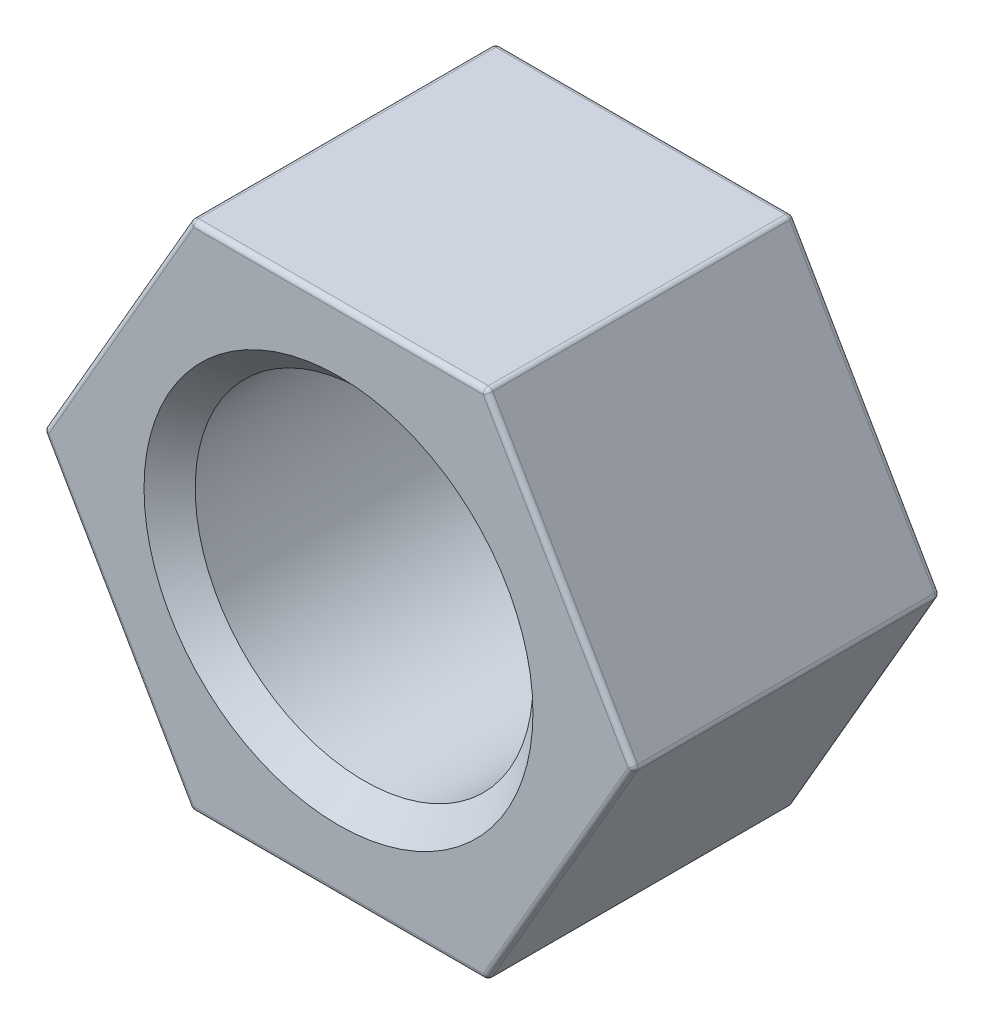
ISO-10303-21;
HEADER;
FILE_DESCRIPTION(('STEP AP214'),'2;1');
FILE_NAME('part.step','',(''),(''),'','','');
FILE_SCHEMA(('AUTOMOTIVE_DESIGN { 1 0 10303 214 1 1 1 1 }'));
ENDSEC;
DATA;
#1=APPLICATION_CONTEXT('core data for automotive mechanical design processes');
#2=APPLICATION_PROTOCOL_DEFINITION('international standard','automotive_design',2000,#1);
#3=PRODUCT_CONTEXT('',#1,'mechanical');
#4=PRODUCT('Part','Part','',(#3));
#5=PRODUCT_RELATED_PRODUCT_CATEGORY('part','',(#4));
#6=PRODUCT_DEFINITION_FORMATION('','',#4);
#7=PRODUCT_DEFINITION_CONTEXT('part definition',#1,'design');
#8=PRODUCT_DEFINITION('design','',#6,#7);
#9=PRODUCT_DEFINITION_SHAPE('','',#8);
#10=(LENGTH_UNIT() NAMED_UNIT(*) SI_UNIT(.MILLI.,.METRE.));
#11=(NAMED_UNIT(*) PLANE_ANGLE_UNIT() SI_UNIT($,.RADIAN.));
#12=(NAMED_UNIT(*) SI_UNIT($,.STERADIAN.) SOLID_ANGLE_UNIT());
#13=UNCERTAINTY_MEASURE_WITH_UNIT(LENGTH_MEASURE(1.E-05),#10,'distance_accuracy_value','');
#14=(GEOMETRIC_REPRESENTATION_CONTEXT(3) GLOBAL_UNCERTAINTY_ASSIGNED_CONTEXT((#13)) GLOBAL_UNIT_ASSIGNED_CONTEXT((#10,
#11,#12)) REPRESENTATION_CONTEXT('',''));
#15=CARTESIAN_POINT('',(0.,0.,0.));
#16=DIRECTION('',(0.,0.,1.));
#17=DIRECTION('',(1.,0.,0.));
#18=AXIS2_PLACEMENT_3D('',#15,#16,#17);
#19=CARTESIAN_POINT('',(0.,0.,6.));
#20=DIRECTION('',(0.,0.,1.));
#21=DIRECTION('',(1.,0.,0.));
#22=AXIS2_PLACEMENT_3D('',#19,#20,#21);
#23=PLANE('',#22);
#24=CARTESIAN_POINT('',(0.,0.,6.));
#25=DIRECTION('',(0.,0.,1.));
#26=DIRECTION('',(1.,0.,0.));
#27=AXIS2_PLACEMENT_3D('',#24,#25,#26);
#28=CIRCLE('',#27,3.8);
#29=CARTESIAN_POINT('',(3.8,0.,6.));
#30=VERTEX_POINT('',#29);
#31=EDGE_CURVE('E11',#30,#30,#28,.F.);
#32=ORIENTED_EDGE('',*,*,#31,.T.);
#33=EDGE_LOOP('',(#32));
#34=FACE_BOUND('',#33,.T.);
#35=DIRECTION('',(-1.,0.,0.));
#36=VECTOR('',#35,1.);
#37=CARTESIAN_POINT('',(-2.88675134594813,4.9,6.));
#38=LINE('',#37,#36);
#39=CARTESIAN_POINT('',(2.82901631902916,4.9,6.));
#40=VERTEX_POINT('',#39);
#41=CARTESIAN_POINT('',(-2.82901631902917,4.9,6.));
#42=VERTEX_POINT('',#41);
#43=EDGE_CURVE('E171',#40,#42,#38,.T.);
#44=ORIENTED_EDGE('',*,*,#43,.T.);
#45=DIRECTION('',(-0.5,-0.866025403784439,0.));
#46=VECTOR('',#45,1.);
#47=CARTESIAN_POINT('',(-5.68690015151781,-0.0500000000000032,6.));
#48=LINE('',#47,#46);
#49=CARTESIAN_POINT('',(-5.65803263805833,0.,6.));
#50=VERTEX_POINT('',#49);
#51=EDGE_CURVE('E213',#42,#50,#48,.T.);
#52=ORIENTED_EDGE('',*,*,#51,.T.);
#53=DIRECTION('',(0.5,-0.866025403784439,0.));
#54=VECTOR('',#53,1.);
#55=CARTESIAN_POINT('',(-2.80014880556968,-4.95,6.));
#56=LINE('',#55,#54);
#57=CARTESIAN_POINT('',(-2.82901631902916,-4.9,6.));
#58=VERTEX_POINT('',#57);
#59=EDGE_CURVE('E211',#50,#58,#56,.T.);
#60=ORIENTED_EDGE('',*,*,#59,.T.);
#61=DIRECTION('',(1.,0.,0.));
#62=VECTOR('',#61,1.);
#63=CARTESIAN_POINT('',(2.88675134594813,-4.9,6.));
#64=LINE('',#63,#62);
#65=CARTESIAN_POINT('',(2.82901631902916,-4.9,6.));
#66=VERTEX_POINT('',#65);
#67=EDGE_CURVE('E209',#58,#66,#64,.T.);
#68=ORIENTED_EDGE('',*,*,#67,.T.);
#69=DIRECTION('',(0.5,0.866025403784439,0.));
#70=VECTOR('',#69,1.);
#71=CARTESIAN_POINT('',(5.68690015151781,0.0500000000000014,6.));
#72=LINE('',#71,#70);
#73=CARTESIAN_POINT('',(5.65803263805833,0.,6.));
#74=VERTEX_POINT('',#73);
#75=EDGE_CURVE('E174',#66,#74,#72,.T.);
#76=ORIENTED_EDGE('',*,*,#75,.T.);
#77=DIRECTION('',(-0.5,0.866025403784438,0.));
#78=VECTOR('',#77,1.);
#79=CARTESIAN_POINT('',(2.80014880556968,4.95,6.));
#80=LINE('',#79,#78);
#81=EDGE_CURVE('E167',#74,#40,#80,.T.);
#82=ORIENTED_EDGE('',*,*,#81,.T.);
#83=EDGE_LOOP('',(#44,#52,#60,#68,#76,#82));
#84=FACE_BOUND('',#83,.T.);
#85=ADVANCED_FACE('F43',(#34,#84),#23,.T.);
#86=CARTESIAN_POINT('',(0.,0.,0.));
#87=DIRECTION('',(0.,0.,1.));
#88=DIRECTION('',(1.,0.,0.));
#89=AXIS2_PLACEMENT_3D('',#86,#87,#88);
#90=PLANE('',#89);
#91=CARTESIAN_POINT('',(0.,0.,0.));
#92=DIRECTION('',(0.,0.,1.));
#93=DIRECTION('',(1.,0.,0.));
#94=AXIS2_PLACEMENT_3D('',#91,#92,#93);
#95=CIRCLE('',#94,3.8);
#96=CARTESIAN_POINT('',(3.8,0.,0.));
#97=VERTEX_POINT('',#96);
#98=EDGE_CURVE('E278',#97,#97,#95,.T.);
#99=ORIENTED_EDGE('',*,*,#98,.T.);
#100=EDGE_LOOP('',(#99));
#101=FACE_BOUND('',#100,.T.);
#102=DIRECTION('',(0.5,-0.866025403784439,0.));
#103=VECTOR('',#102,1.);
#104=CARTESIAN_POINT('',(-4.24352447854375,-2.45,0.));
#105=LINE('',#104,#103);
#106=CARTESIAN_POINT('',(-2.82901631902916,-4.9,0.));
#107=VERTEX_POINT('',#106);
#108=CARTESIAN_POINT('',(-5.65803263805833,0.,0.));
#109=VERTEX_POINT('',#108);
#110=EDGE_CURVE('E232',#107,#109,#105,.F.);
#111=ORIENTED_EDGE('',*,*,#110,.T.);
#112=DIRECTION('',(-0.5,-0.866025403784439,0.));
#113=VECTOR('',#112,1.);
#114=CARTESIAN_POINT('',(-4.24352447854375,2.45,0.));
#115=LINE('',#114,#113);
#116=CARTESIAN_POINT('',(-2.82901631902917,4.9,0.));
#117=VERTEX_POINT('',#116);
#118=EDGE_CURVE('E234',#109,#117,#115,.F.);
#119=ORIENTED_EDGE('',*,*,#118,.T.);
#120=DIRECTION('',(-1.,0.,0.));
#121=VECTOR('',#120,1.);
#122=CARTESIAN_POINT('',(0.,4.9,0.));
#123=LINE('',#122,#121);
#124=CARTESIAN_POINT('',(2.82901631902916,4.9,0.));
#125=VERTEX_POINT('',#124);
#126=EDGE_CURVE('E224',#117,#125,#123,.F.);
#127=ORIENTED_EDGE('',*,*,#126,.T.);
#128=DIRECTION('',(-0.5,0.866025403784438,0.));
#129=VECTOR('',#128,1.);
#130=CARTESIAN_POINT('',(4.24352447854374,2.45,0.));
#131=LINE('',#130,#129);
#132=CARTESIAN_POINT('',(5.65803263805833,0.,0.));
#133=VERTEX_POINT('',#132);
#134=EDGE_CURVE('E226',#125,#133,#131,.F.);
#135=ORIENTED_EDGE('',*,*,#134,.T.);
#136=DIRECTION('',(0.5,0.866025403784439,0.));
#137=VECTOR('',#136,1.);
#138=CARTESIAN_POINT('',(4.24352447854375,-2.45,0.));
#139=LINE('',#138,#137);
#140=CARTESIAN_POINT('',(2.82901631902916,-4.9,0.));
#141=VERTEX_POINT('',#140);
#142=EDGE_CURVE('E228',#133,#141,#139,.F.);
#143=ORIENTED_EDGE('',*,*,#142,.T.);
#144=DIRECTION('',(1.,0.,0.));
#145=VECTOR('',#144,1.);
#146=CARTESIAN_POINT('',(0.,-4.9,0.));
#147=LINE('',#146,#145);
#148=EDGE_CURVE('E230',#141,#107,#147,.F.);
#149=ORIENTED_EDGE('',*,*,#148,.T.);
#150=EDGE_LOOP('',(#111,#119,#127,#135,#143,#149));
#151=FACE_BOUND('',#150,.T.);
#152=ADVANCED_FACE('F379',(#101,#151),#90,.F.);
#153=CARTESIAN_POINT('',(-5.77350269189625,0.,6.));
#154=DIRECTION('',(0.866025403784438,0.5,0.));
#155=DIRECTION('',(-0.5,0.866025403784439,0.));
#156=AXIS2_PLACEMENT_3D('',#153,#154,#155);
#157=PLANE('',#156);
#158=DIRECTION('',(0.5,-0.866025403784439,0.));
#159=VECTOR('',#158,1.);
#160=CARTESIAN_POINT('',(-5.77350269189626,0.,5.9));
#161=LINE('',#160,#159);
#162=CARTESIAN_POINT('',(-2.91561885940761,-4.95,5.9));
#163=VERTEX_POINT('',#162);
#164=CARTESIAN_POINT('',(-5.74463517843677,-0.0500000000000038,5.9));
#165=VERTEX_POINT('',#164);
#166=EDGE_CURVE('E241',#163,#165,#161,.F.);
#167=ORIENTED_EDGE('',*,*,#166,.T.);
#168=DIRECTION('',(0.,0.,-1.));
#169=VECTOR('',#168,1.);
#170=CARTESIAN_POINT('',(-5.74463517843677,-0.0500000000000038,6.));
#171=LINE('',#170,#169);
#172=CARTESIAN_POINT('',(-5.74463517843677,-0.0500000000000038,0.1));
#173=VERTEX_POINT('',#172);
#174=EDGE_CURVE('E243',#165,#173,#171,.T.);
#175=ORIENTED_EDGE('',*,*,#174,.T.);
#176=DIRECTION('',(0.5,-0.866025403784439,0.));
#177=VECTOR('',#176,1.);
#178=CARTESIAN_POINT('',(-5.77350269189625,0.,0.1));
#179=LINE('',#178,#177);
#180=CARTESIAN_POINT('',(-2.91561885940761,-4.95,0.1));
#181=VERTEX_POINT('',#180);
#182=EDGE_CURVE('E239',#173,#181,#179,.T.);
#183=ORIENTED_EDGE('',*,*,#182,.T.);
#184=DIRECTION('',(0.,0.,-1.));
#185=VECTOR('',#184,1.);
#186=CARTESIAN_POINT('',(-2.91561885940761,-4.95,6.));
#187=LINE('',#186,#185);
#188=EDGE_CURVE('E237',#181,#163,#187,.F.);
#189=ORIENTED_EDGE('',*,*,#188,.T.);
#190=EDGE_LOOP('',(#167,#175,#183,#189));
#191=FACE_BOUND('',#190,.T.);
#192=ADVANCED_FACE('F382',(#191),#157,.F.);
#193=CARTESIAN_POINT('',(-2.88675134594813,-5.,6.));
#194=DIRECTION('',(0.,1.,0.));
#195=DIRECTION('',(0.,0.,1.));
#196=AXIS2_PLACEMENT_3D('',#193,#194,#195);
#197=PLANE('',#196);
#198=DIRECTION('',(1.,0.,0.));
#199=VECTOR('',#198,1.);
#200=CARTESIAN_POINT('',(-2.88675134594813,-5.,5.9));
#201=LINE('',#200,#199);
#202=CARTESIAN_POINT('',(2.82901631902916,-5.,5.9));
#203=VERTEX_POINT('',#202);
#204=CARTESIAN_POINT('',(-2.82901631902916,-5.,5.9));
#205=VERTEX_POINT('',#204);
#206=EDGE_CURVE('E250',#203,#205,#201,.F.);
#207=ORIENTED_EDGE('',*,*,#206,.T.);
#208=DIRECTION('',(0.,0.,-1.));
#209=VECTOR('',#208,1.);
#210=CARTESIAN_POINT('',(-2.82901631902916,-5.,6.));
#211=LINE('',#210,#209);
#212=CARTESIAN_POINT('',(-2.82901631902916,-5.,0.1));
#213=VERTEX_POINT('',#212);
#214=EDGE_CURVE('E252',#205,#213,#211,.T.);
#215=ORIENTED_EDGE('',*,*,#214,.T.);
#216=DIRECTION('',(1.,0.,0.));
#217=VECTOR('',#216,1.);
#218=CARTESIAN_POINT('',(-2.88675134594813,-5.,0.1));
#219=LINE('',#218,#217);
#220=CARTESIAN_POINT('',(2.82901631902916,-5.,0.1));
#221=VERTEX_POINT('',#220);
#222=EDGE_CURVE('E248',#213,#221,#219,.T.);
#223=ORIENTED_EDGE('',*,*,#222,.T.);
#224=DIRECTION('',(0.,0.,-1.));
#225=VECTOR('',#224,1.);
#226=CARTESIAN_POINT('',(2.82901631902916,-5.,6.));
#227=LINE('',#226,#225);
#228=EDGE_CURVE('E246',#221,#203,#227,.F.);
#229=ORIENTED_EDGE('',*,*,#228,.T.);
#230=EDGE_LOOP('',(#207,#215,#223,#229));
#231=FACE_BOUND('',#230,.T.);
#232=ADVANCED_FACE('F444',(#231),#197,.F.);
#233=CARTESIAN_POINT('',(2.88675134594813,-5.,6.));
#234=DIRECTION('',(-0.866025403784439,0.5,0.));
#235=DIRECTION('',(-0.5,-0.866025403784439,0.));
#236=AXIS2_PLACEMENT_3D('',#233,#234,#235);
#237=PLANE('',#236);
#238=DIRECTION('',(0.5,0.866025403784439,0.));
#239=VECTOR('',#238,1.);
#240=CARTESIAN_POINT('',(2.88675134594813,-5.,5.9));
#241=LINE('',#240,#239);
#242=CARTESIAN_POINT('',(5.74463517843677,-0.0499999999999989,5.9));
#243=VERTEX_POINT('',#242);
#244=CARTESIAN_POINT('',(2.91561885940761,-4.95,5.9));
#245=VERTEX_POINT('',#244);
#246=EDGE_CURVE('E259',#243,#245,#241,.F.);
#247=ORIENTED_EDGE('',*,*,#246,.T.);
#248=DIRECTION('',(0.,0.,-1.));
#249=VECTOR('',#248,1.);
#250=CARTESIAN_POINT('',(2.91561885940761,-4.95,6.));
#251=LINE('',#250,#249);
#252=CARTESIAN_POINT('',(2.91561885940761,-4.95,0.1));
#253=VERTEX_POINT('',#252);
#254=EDGE_CURVE('E261',#245,#253,#251,.T.);
#255=ORIENTED_EDGE('',*,*,#254,.T.);
#256=DIRECTION('',(0.5,0.866025403784439,0.));
#257=VECTOR('',#256,1.);
#258=CARTESIAN_POINT('',(2.88675134594813,-5.,0.1));
#259=LINE('',#258,#257);
#260=CARTESIAN_POINT('',(5.74463517843677,-0.0499999999999989,0.1));
#261=VERTEX_POINT('',#260);
#262=EDGE_CURVE('E257',#253,#261,#259,.T.);
#263=ORIENTED_EDGE('',*,*,#262,.T.);
#264=DIRECTION('',(0.,0.,-1.));
#265=VECTOR('',#264,1.);
#266=CARTESIAN_POINT('',(5.74463517843677,-0.0499999999999988,6.));
#267=LINE('',#266,#265);
#268=EDGE_CURVE('E255',#261,#243,#267,.F.);
#269=ORIENTED_EDGE('',*,*,#268,.T.);
#270=EDGE_LOOP('',(#247,#255,#263,#269));
#271=FACE_BOUND('',#270,.T.);
#272=ADVANCED_FACE('F508',(#271),#237,.F.);
#273=CARTESIAN_POINT('',(5.77350269189625,0.,6.));
#274=DIRECTION('',(-0.866025403784438,-0.5,0.));
#275=DIRECTION('',(0.5,-0.866025403784438,0.));
#276=AXIS2_PLACEMENT_3D('',#273,#274,#275);
#277=PLANE('',#276);
#278=DIRECTION('',(-0.5,0.866025403784438,0.));
#279=VECTOR('',#278,1.);
#280=CARTESIAN_POINT('',(5.77350269189625,0.,5.9));
#281=LINE('',#280,#279);
#282=CARTESIAN_POINT('',(2.9156188594076,4.95,5.9));
#283=VERTEX_POINT('',#282);
#284=CARTESIAN_POINT('',(5.74463517843677,0.0500000000000007,5.9));
#285=VERTEX_POINT('',#284);
#286=EDGE_CURVE('E184',#283,#285,#281,.F.);
#287=ORIENTED_EDGE('',*,*,#286,.T.);
#288=DIRECTION('',(0.,0.,-1.));
#289=VECTOR('',#288,1.);
#290=CARTESIAN_POINT('',(5.74463517843677,0.0500000000000008,6.));
#291=LINE('',#290,#289);
#292=CARTESIAN_POINT('',(5.74463517843677,0.0500000000000007,0.1));
#293=VERTEX_POINT('',#292);
#294=EDGE_CURVE('E269',#285,#293,#291,.T.);
#295=ORIENTED_EDGE('',*,*,#294,.T.);
#296=DIRECTION('',(-0.5,0.866025403784438,0.));
#297=VECTOR('',#296,1.);
#298=CARTESIAN_POINT('',(5.77350269189625,0.,0.1));
#299=LINE('',#298,#297);
#300=CARTESIAN_POINT('',(2.9156188594076,4.95,0.1));
#301=VERTEX_POINT('',#300);
#302=EDGE_CURVE('E266',#293,#301,#299,.T.);
#303=ORIENTED_EDGE('',*,*,#302,.T.);
#304=DIRECTION('',(0.,0.,-1.));
#305=VECTOR('',#304,1.);
#306=CARTESIAN_POINT('',(2.9156188594076,4.95,6.));
#307=LINE('',#306,#305);
#308=EDGE_CURVE('E264',#301,#283,#307,.F.);
#309=ORIENTED_EDGE('',*,*,#308,.T.);
#310=EDGE_LOOP('',(#287,#295,#303,#309));
#311=FACE_BOUND('',#310,.T.);
#312=ADVANCED_FACE('F467',(#311),#277,.F.);
#313=CARTESIAN_POINT('',(2.88675134594812,5.,6.));
#314=DIRECTION('',(0.,-1.,0.));
#315=DIRECTION('',(1.,0.,0.));
#316=AXIS2_PLACEMENT_3D('',#313,#314,#315);
#317=PLANE('',#316);
#318=DIRECTION('',(-1.,0.,0.));
#319=VECTOR('',#318,1.);
#320=CARTESIAN_POINT('',(2.88675134594812,5.,5.9));
#321=LINE('',#320,#319);
#322=CARTESIAN_POINT('',(-2.82901631902917,5.,5.9));
#323=VERTEX_POINT('',#322);
#324=CARTESIAN_POINT('',(2.82901631902916,5.,5.9));
#325=VERTEX_POINT('',#324);
#326=EDGE_CURVE('E59',#323,#325,#321,.F.);
#327=ORIENTED_EDGE('',*,*,#326,.T.);
#328=DIRECTION('',(0.,0.,-1.));
#329=VECTOR('',#328,1.);
#330=CARTESIAN_POINT('',(2.82901631902916,5.,6.));
#331=LINE('',#330,#329);
#332=CARTESIAN_POINT('',(2.82901631902916,5.,0.1));
#333=VERTEX_POINT('',#332);
#334=EDGE_CURVE('E276',#325,#333,#331,.T.);
#335=ORIENTED_EDGE('',*,*,#334,.T.);
#336=DIRECTION('',(-1.,0.,0.));
#337=VECTOR('',#336,1.);
#338=CARTESIAN_POINT('',(2.88675134594812,5.,0.1));
#339=LINE('',#338,#337);
#340=CARTESIAN_POINT('',(-2.82901631902917,5.,0.1));
#341=VERTEX_POINT('',#340);
#342=EDGE_CURVE('E272',#333,#341,#339,.T.);
#343=ORIENTED_EDGE('',*,*,#342,.T.);
#344=DIRECTION('',(0.,0.,-1.));
#345=VECTOR('',#344,1.);
#346=CARTESIAN_POINT('',(-2.82901631902917,5.,6.));
#347=LINE('',#346,#345);
#348=EDGE_CURVE('E64',#341,#323,#347,.F.);
#349=ORIENTED_EDGE('',*,*,#348,.T.);
#350=EDGE_LOOP('',(#327,#335,#343,#349));
#351=FACE_BOUND('',#350,.T.);
#352=ADVANCED_FACE('F473',(#351),#317,.F.);
#353=CARTESIAN_POINT('',(-2.88675134594813,5.,6.));
#354=DIRECTION('',(0.866025403784439,-0.5,0.));
#355=DIRECTION('',(0.5,0.866025403784439,0.));
#356=AXIS2_PLACEMENT_3D('',#353,#354,#355);
#357=PLANE('',#356);
#358=DIRECTION('',(-0.5,-0.866025403784439,0.));
#359=VECTOR('',#358,1.);
#360=CARTESIAN_POINT('',(-2.88675134594813,5.,0.1));
#361=LINE('',#360,#359);
#362=CARTESIAN_POINT('',(-2.91561885940761,4.95,0.1));
#363=VERTEX_POINT('',#362);
#364=CARTESIAN_POINT('',(-5.74463517843677,0.0499999999999969,0.1));
#365=VERTEX_POINT('',#364);
#366=EDGE_CURVE('E217',#363,#365,#361,.T.);
#367=ORIENTED_EDGE('',*,*,#366,.T.);
#368=DIRECTION('',(0.,0.,-1.));
#369=VECTOR('',#368,1.);
#370=CARTESIAN_POINT('',(-5.74463517843677,0.0499999999999971,6.));
#371=LINE('',#370,#369);
#372=CARTESIAN_POINT('',(-5.74463517843677,0.0499999999999969,5.9));
#373=VERTEX_POINT('',#372);
#374=EDGE_CURVE('E222',#365,#373,#371,.F.);
#375=ORIENTED_EDGE('',*,*,#374,.T.);
#376=DIRECTION('',(-0.5,-0.866025403784439,0.));
#377=VECTOR('',#376,1.);
#378=CARTESIAN_POINT('',(-2.88675134594813,5.,5.9));
#379=LINE('',#378,#377);
#380=CARTESIAN_POINT('',(-2.91561885940761,4.95,5.9));
#381=VERTEX_POINT('',#380);
#382=EDGE_CURVE('E219',#373,#381,#379,.F.);
#383=ORIENTED_EDGE('',*,*,#382,.T.);
#384=DIRECTION('',(0.,0.,-1.));
#385=VECTOR('',#384,1.);
#386=CARTESIAN_POINT('',(-2.91561885940761,4.95,6.));
#387=LINE('',#386,#385);
#388=EDGE_CURVE('E215',#381,#363,#387,.T.);
#389=ORIENTED_EDGE('',*,*,#388,.T.);
#390=EDGE_LOOP('',(#367,#375,#383,#389));
#391=FACE_BOUND('',#390,.T.);
#392=ADVANCED_FACE('F408',(#391),#357,.F.);
#393=CARTESIAN_POINT('',(0.,0.,6.));
#394=DIRECTION('',(0.,0.,-1.));
#395=DIRECTION('',(-1.,0.,0.));
#396=AXIS2_PLACEMENT_3D('',#393,#394,#395);
#397=CYLINDRICAL_SURFACE('',#396,3.3);
#398=CARTESIAN_POINT('',(0.,0.,0.500000000000002));
#399=DIRECTION('',(0.,0.,1.));
#400=DIRECTION('',(1.,0.,0.));
#401=AXIS2_PLACEMENT_3D('',#398,#399,#400);
#402=CIRCLE('',#401,3.3);
#403=CARTESIAN_POINT('',(3.3,0.,0.500000000000002));
#404=VERTEX_POINT('',#403);
#405=EDGE_CURVE('E52',#404,#404,#402,.F.);
#406=ORIENTED_EDGE('',*,*,#405,.T.);
#407=EDGE_LOOP('',(#406));
#408=FACE_BOUND('',#407,.T.);
#409=CARTESIAN_POINT('',(0.,0.,5.5));
#410=DIRECTION('',(0.,0.,1.));
#411=DIRECTION('',(1.,0.,0.));
#412=AXIS2_PLACEMENT_3D('',#409,#410,#411);
#413=CIRCLE('',#412,3.3);
#414=CARTESIAN_POINT('',(3.3,0.,5.5));
#415=VERTEX_POINT('',#414);
#416=EDGE_CURVE('E365',#415,#415,#413,.T.);
#417=ORIENTED_EDGE('',*,*,#416,.T.);
#418=EDGE_LOOP('',(#417));
#419=FACE_BOUND('',#418,.T.);
#420=ADVANCED_FACE('F370',(#408,#419),#397,.F.);
#421=CARTESIAN_POINT('',(2.80014880556968,-4.95,0.1));
#422=DIRECTION('',(0.5,0.866025403784439,0.));
#423=DIRECTION('',(-0.866025403784439,0.5,0.));
#424=AXIS2_PLACEMENT_3D('',#421,#422,#423);
#425=CYLINDRICAL_SURFACE('',#424,0.1);
#426=CARTESIAN_POINT('',(5.65803263805833,0.,0.1));
#427=DIRECTION('',(0.499999999999999,0.866025403784439,0.));
#428=DIRECTION('',(-0.866025403784439,0.499999999999999,0.));
#429=AXIS2_PLACEMENT_3D('',#426,#427,#428);
#430=CIRCLE('',#429,0.1);
#431=EDGE_CURVE('E202',#261,#133,#430,.T.);
#432=ORIENTED_EDGE('',*,*,#431,.F.);
#433=ORIENTED_EDGE('',*,*,#262,.F.);
#434=CARTESIAN_POINT('',(2.82901631902916,-4.9,0.1));
#435=DIRECTION('',(-0.499999999999997,-0.86602540378444,0.));
#436=DIRECTION('',(0.866025403784441,-0.499999999999997,0.));
#437=AXIS2_PLACEMENT_3D('',#434,#435,#436);
#438=CIRCLE('',#437,0.1);
#439=EDGE_CURVE('E205',#141,#253,#438,.T.);
#440=ORIENTED_EDGE('',*,*,#439,.F.);
#441=ORIENTED_EDGE('',*,*,#142,.F.);
#442=EDGE_LOOP('',(#432,#433,#440,#441));
#443=FACE_BOUND('',#442,.T.);
#444=ADVANCED_FACE('F679',(#443),#425,.T.);
#445=CARTESIAN_POINT('',(5.65803263805833,0.,0.1));
#446=DIRECTION('',(0.,0.,-1.));
#447=DIRECTION('',(0.,1.,0.));
#448=AXIS2_PLACEMENT_3D('',#445,#446,#447);
#449=SPHERICAL_SURFACE('',#448,0.1);
#450=CARTESIAN_POINT('',(5.65803263805833,0.,0.1));
#451=DIRECTION('',(0.,0.,-1.));
#452=DIRECTION('',(-1.,0.,0.));
#453=AXIS2_PLACEMENT_3D('',#450,#451,#452);
#454=CIRCLE('',#453,0.1);
#455=EDGE_CURVE('E355',#261,#293,#454,.F.);
#456=ORIENTED_EDGE('',*,*,#455,.F.);
#457=ORIENTED_EDGE('',*,*,#431,.T.);
#458=CARTESIAN_POINT('',(5.65803263805833,0.,0.1));
#459=DIRECTION('',(0.5,-0.866025403784439,0.));
#460=DIRECTION('',(0.866025403784439,0.5,0.));
#461=AXIS2_PLACEMENT_3D('',#458,#459,#460);
#462=CIRCLE('',#461,0.1);
#463=EDGE_CURVE('E358',#293,#133,#462,.F.);
#464=ORIENTED_EDGE('',*,*,#463,.F.);
#465=EDGE_LOOP('',(#456,#457,#464));
#466=FACE_BOUND('',#465,.T.);
#467=ADVANCED_FACE('F683',(#466),#449,.T.);
#468=CARTESIAN_POINT('',(2.82901631902916,-4.9,0.1));
#469=DIRECTION('',(0.,0.,-1.));
#470=DIRECTION('',(-1.,0.,0.));
#471=AXIS2_PLACEMENT_3D('',#468,#469,#470);
#472=SPHERICAL_SURFACE('',#471,0.1);
#473=CARTESIAN_POINT('',(2.82901631902916,-4.9,0.1));
#474=DIRECTION('',(1.,0.,0.));
#475=DIRECTION('',(0.,0.,-1.));
#476=AXIS2_PLACEMENT_3D('',#473,#474,#475);
#477=CIRCLE('',#476,0.1);
#478=EDGE_CURVE('E350',#141,#221,#477,.F.);
#479=ORIENTED_EDGE('',*,*,#478,.F.);
#480=ORIENTED_EDGE('',*,*,#439,.T.);
#481=CARTESIAN_POINT('',(2.82901631902916,-4.9,0.1));
#482=DIRECTION('',(0.,0.,-1.));
#483=DIRECTION('',(-1.,0.,0.));
#484=AXIS2_PLACEMENT_3D('',#481,#482,#483);
#485=CIRCLE('',#484,0.1);
#486=EDGE_CURVE('E353',#221,#253,#485,.F.);
#487=ORIENTED_EDGE('',*,*,#486,.F.);
#488=EDGE_LOOP('',(#479,#480,#487));
#489=FACE_BOUND('',#488,.T.);
#490=ADVANCED_FACE('F689',(#489),#472,.T.);
#491=CARTESIAN_POINT('',(5.68690015151781,-0.0499999999999987,0.1));
#492=DIRECTION('',(-0.5,0.866025403784438,0.));
#493=DIRECTION('',(-0.866025403784438,-0.5,0.));
#494=AXIS2_PLACEMENT_3D('',#491,#492,#493);
#495=CYLINDRICAL_SURFACE('',#494,0.1);
#496=ORIENTED_EDGE('',*,*,#463,.T.);
#497=ORIENTED_EDGE('',*,*,#134,.F.);
#498=CARTESIAN_POINT('',(2.82901631902916,4.9,0.1));
#499=DIRECTION('',(-0.499999999999999,0.866025403784439,0.));
#500=DIRECTION('',(-0.866025403784439,-0.499999999999999,0.));
#501=AXIS2_PLACEMENT_3D('',#498,#499,#500);
#502=CIRCLE('',#501,0.1);
#503=EDGE_CURVE('E347',#301,#125,#502,.T.);
#504=ORIENTED_EDGE('',*,*,#503,.F.);
#505=ORIENTED_EDGE('',*,*,#302,.F.);
#506=EDGE_LOOP('',(#496,#497,#504,#505));
#507=FACE_BOUND('',#506,.T.);
#508=ADVANCED_FACE('F480',(#507),#495,.T.);
#509=CARTESIAN_POINT('',(5.65803263805833,0.,6.));
#510=DIRECTION('',(0.,0.,-1.));
#511=DIRECTION('',(-1.,0.,0.));
#512=AXIS2_PLACEMENT_3D('',#509,#510,#511);
#513=CYLINDRICAL_SURFACE('',#512,0.1);
#514=ORIENTED_EDGE('',*,*,#455,.T.);
#515=ORIENTED_EDGE('',*,*,#294,.F.);
#516=CARTESIAN_POINT('',(5.65803263805833,0.,5.9));
#517=DIRECTION('',(0.,0.,1.));
#518=DIRECTION('',(1.,0.,0.));
#519=AXIS2_PLACEMENT_3D('',#516,#517,#518);
#520=CIRCLE('',#519,0.1);
#521=EDGE_CURVE('E344',#243,#285,#520,.T.);
#522=ORIENTED_EDGE('',*,*,#521,.F.);
#523=ORIENTED_EDGE('',*,*,#268,.F.);
#524=EDGE_LOOP('',(#514,#515,#522,#523));
#525=FACE_BOUND('',#524,.T.);
#526=ADVANCED_FACE('F464',(#525),#513,.T.);
#527=CARTESIAN_POINT('',(4.24352447854375,-2.45,5.9));
#528=DIRECTION('',(-0.5,-0.866025403784439,0.));
#529=DIRECTION('',(0.866025403784439,-0.5,0.));
#530=AXIS2_PLACEMENT_3D('',#527,#528,#529);
#531=CYLINDRICAL_SURFACE('',#530,0.1);
#532=CARTESIAN_POINT('',(2.82901631902916,-4.9,5.9));
#533=DIRECTION('',(-0.499999999999997,-0.866025403784441,0.));
#534=DIRECTION('',(0.866025403784441,-0.499999999999997,0.));
#535=AXIS2_PLACEMENT_3D('',#532,#533,#534);
#536=CIRCLE('',#535,0.1);
#537=EDGE_CURVE('E338',#245,#66,#536,.T.);
#538=ORIENTED_EDGE('',*,*,#537,.F.);
#539=ORIENTED_EDGE('',*,*,#246,.F.);
#540=CARTESIAN_POINT('',(5.65803263805833,0.,5.9));
#541=DIRECTION('',(0.500000000000002,0.866025403784438,0.));
#542=DIRECTION('',(-0.866025403784438,0.500000000000002,0.));
#543=AXIS2_PLACEMENT_3D('',#540,#541,#542);
#544=CIRCLE('',#543,0.1);
#545=EDGE_CURVE('E341',#74,#243,#544,.T.);
#546=ORIENTED_EDGE('',*,*,#545,.F.);
#547=ORIENTED_EDGE('',*,*,#75,.F.);
#548=EDGE_LOOP('',(#538,#539,#546,#547));
#549=FACE_BOUND('',#548,.T.);
#550=ADVANCED_FACE('F456',(#549),#531,.T.);
#551=CARTESIAN_POINT('',(2.82901631902916,-4.9,6.));
#552=DIRECTION('',(0.,0.,-1.));
#553=DIRECTION('',(-1.,0.,0.));
#554=AXIS2_PLACEMENT_3D('',#551,#552,#553);
#555=CYLINDRICAL_SURFACE('',#554,0.1);
#556=ORIENTED_EDGE('',*,*,#486,.T.);
#557=ORIENTED_EDGE('',*,*,#254,.F.);
#558=CARTESIAN_POINT('',(2.82901631902916,-4.9,5.9));
#559=DIRECTION('',(0.,0.,1.));
#560=DIRECTION('',(1.,0.,0.));
#561=AXIS2_PLACEMENT_3D('',#558,#559,#560);
#562=CIRCLE('',#561,0.1);
#563=EDGE_CURVE('E335',#203,#245,#562,.T.);
#564=ORIENTED_EDGE('',*,*,#563,.F.);
#565=ORIENTED_EDGE('',*,*,#228,.F.);
#566=EDGE_LOOP('',(#556,#557,#564,#565));
#567=FACE_BOUND('',#566,.T.);
#568=ADVANCED_FACE('F450',(#567),#555,.T.);
#569=CARTESIAN_POINT('',(-2.88675134594813,-4.9,0.1));
#570=DIRECTION('',(1.,0.,0.));
#571=DIRECTION('',(0.,0.,-1.));
#572=AXIS2_PLACEMENT_3D('',#569,#570,#571);
#573=CYLINDRICAL_SURFACE('',#572,0.1);
#574=ORIENTED_EDGE('',*,*,#478,.T.);
#575=ORIENTED_EDGE('',*,*,#222,.F.);
#576=CARTESIAN_POINT('',(-2.82901631902916,-4.9,0.1));
#577=DIRECTION('',(-1.,0.,0.));
#578=DIRECTION('',(0.,0.,1.));
#579=AXIS2_PLACEMENT_3D('',#576,#577,#578);
#580=CIRCLE('',#579,0.1);
#581=EDGE_CURVE('E332',#107,#213,#580,.T.);
#582=ORIENTED_EDGE('',*,*,#581,.F.);
#583=ORIENTED_EDGE('',*,*,#148,.F.);
#584=EDGE_LOOP('',(#574,#575,#582,#583));
#585=FACE_BOUND('',#584,.T.);
#586=ADVANCED_FACE('F485',(#585),#573,.T.);
#587=CARTESIAN_POINT('',(2.82901631902916,4.9,0.1));
#588=DIRECTION('',(0.,0.,-1.));
#589=DIRECTION('',(-1.,0.,0.));
#590=AXIS2_PLACEMENT_3D('',#587,#588,#589);
#591=SPHERICAL_SURFACE('',#590,0.1);
#592=CARTESIAN_POINT('',(2.82901631902916,4.9,0.1));
#593=DIRECTION('',(0.,0.,-1.));
#594=DIRECTION('',(-1.,0.,0.));
#595=AXIS2_PLACEMENT_3D('',#592,#593,#594);
#596=CIRCLE('',#595,0.1);
#597=EDGE_CURVE('E326',#301,#333,#596,.F.);
#598=ORIENTED_EDGE('',*,*,#597,.F.);
#599=ORIENTED_EDGE('',*,*,#503,.T.);
#600=CARTESIAN_POINT('',(2.82901631902916,4.9,0.1));
#601=DIRECTION('',(1.,0.,0.));
#602=DIRECTION('',(0.,1.,0.));
#603=AXIS2_PLACEMENT_3D('',#600,#601,#602);
#604=CIRCLE('',#603,0.1);
#605=EDGE_CURVE('E329',#333,#125,#604,.F.);
#606=ORIENTED_EDGE('',*,*,#605,.F.);
#607=EDGE_LOOP('',(#598,#599,#606));
#608=FACE_BOUND('',#607,.T.);
#609=ADVANCED_FACE('F483',(#608),#591,.T.);
#610=CARTESIAN_POINT('',(5.65803263805833,0.,5.9));
#611=DIRECTION('',(0.,0.,1.));
#612=DIRECTION('',(0.,-1.,0.));
#613=AXIS2_PLACEMENT_3D('',#610,#611,#612);
#614=SPHERICAL_SURFACE('',#613,0.1);
#615=ORIENTED_EDGE('',*,*,#545,.T.);
#616=ORIENTED_EDGE('',*,*,#521,.T.);
#617=CARTESIAN_POINT('',(5.65803263805833,0.,5.9));
#618=DIRECTION('',(0.499999999999999,-0.866025403784439,0.));
#619=DIRECTION('',(0.866025403784439,0.499999999999999,0.));
#620=AXIS2_PLACEMENT_3D('',#617,#618,#619);
#621=CIRCLE('',#620,0.1);
#622=EDGE_CURVE('E324',#74,#285,#621,.F.);
#623=ORIENTED_EDGE('',*,*,#622,.F.);
#624=EDGE_LOOP('',(#615,#616,#623));
#625=FACE_BOUND('',#624,.T.);
#626=ADVANCED_FACE('F460',(#625),#614,.T.);
#627=CARTESIAN_POINT('',(2.82901631902916,-4.9,5.9));
#628=DIRECTION('',(0.,0.,1.));
#629=DIRECTION('',(1.,0.,0.));
#630=AXIS2_PLACEMENT_3D('',#627,#628,#629);
#631=SPHERICAL_SURFACE('',#630,0.1);
#632=ORIENTED_EDGE('',*,*,#563,.T.);
#633=ORIENTED_EDGE('',*,*,#537,.T.);
#634=CARTESIAN_POINT('',(2.82901631902916,-4.9,5.9));
#635=DIRECTION('',(1.,0.,0.));
#636=DIRECTION('',(0.,1.,0.));
#637=AXIS2_PLACEMENT_3D('',#634,#635,#636);
#638=CIRCLE('',#637,0.1);
#639=EDGE_CURVE('E321',#203,#66,#638,.F.);
#640=ORIENTED_EDGE('',*,*,#639,.F.);
#641=EDGE_LOOP('',(#632,#633,#640));
#642=FACE_BOUND('',#641,.T.);
#643=ADVANCED_FACE('F453',(#642),#631,.T.);
#644=CARTESIAN_POINT('',(-2.82901631902916,-4.9,0.1));
#645=DIRECTION('',(0.,0.,-1.));
#646=DIRECTION('',(-1.,0.,0.));
#647=AXIS2_PLACEMENT_3D('',#644,#645,#646);
#648=SPHERICAL_SURFACE('',#647,0.1);
#649=CARTESIAN_POINT('',(-2.82901631902916,-4.9,0.1));
#650=DIRECTION('',(0.499999999999999,-0.866025403784439,0.));
#651=DIRECTION('',(0.866025403784439,0.499999999999999,0.));
#652=AXIS2_PLACEMENT_3D('',#649,#650,#651);
#653=CIRCLE('',#652,0.1);
#654=EDGE_CURVE('E316',#107,#181,#653,.F.);
#655=ORIENTED_EDGE('',*,*,#654,.F.);
#656=ORIENTED_EDGE('',*,*,#581,.T.);
#657=CARTESIAN_POINT('',(-2.82901631902916,-4.9,0.1));
#658=DIRECTION('',(0.,0.,-1.));
#659=DIRECTION('',(-1.,0.,0.));
#660=AXIS2_PLACEMENT_3D('',#657,#658,#659);
#661=CIRCLE('',#660,0.1);
#662=EDGE_CURVE('E319',#181,#213,#661,.F.);
#663=ORIENTED_EDGE('',*,*,#662,.F.);
#664=EDGE_LOOP('',(#655,#656,#663));
#665=FACE_BOUND('',#664,.T.);
#666=ADVANCED_FACE('F553',(#665),#648,.T.);
#667=CARTESIAN_POINT('',(2.88675134594812,4.9,0.1));
#668=DIRECTION('',(-1.,0.,0.));
#669=DIRECTION('',(0.,-1.,0.));
#670=AXIS2_PLACEMENT_3D('',#667,#668,#669);
#671=CYLINDRICAL_SURFACE('',#670,0.1);
#672=ORIENTED_EDGE('',*,*,#605,.T.);
#673=ORIENTED_EDGE('',*,*,#126,.F.);
#674=CARTESIAN_POINT('',(-2.82901631902917,4.9,0.1));
#675=DIRECTION('',(-1.,0.,0.));
#676=DIRECTION('',(0.,0.,1.));
#677=AXIS2_PLACEMENT_3D('',#674,#675,#676);
#678=CIRCLE('',#677,0.1);
#679=EDGE_CURVE('E311',#341,#117,#678,.T.);
#680=ORIENTED_EDGE('',*,*,#679,.F.);
#681=ORIENTED_EDGE('',*,*,#342,.F.);
#682=EDGE_LOOP('',(#672,#673,#680,#681));
#683=FACE_BOUND('',#682,.T.);
#684=ADVANCED_FACE('F476',(#683),#671,.T.);
#685=CARTESIAN_POINT('',(2.82901631902916,4.9,6.));
#686=DIRECTION('',(0.,0.,-1.));
#687=DIRECTION('',(-1.,0.,0.));
#688=AXIS2_PLACEMENT_3D('',#685,#686,#687);
#689=CYLINDRICAL_SURFACE('',#688,0.1);
#690=ORIENTED_EDGE('',*,*,#597,.T.);
#691=ORIENTED_EDGE('',*,*,#334,.F.);
#692=CARTESIAN_POINT('',(2.82901631902916,4.9,5.9));
#693=DIRECTION('',(0.,0.,1.));
#694=DIRECTION('',(1.,0.,0.));
#695=AXIS2_PLACEMENT_3D('',#692,#693,#694);
#696=CIRCLE('',#695,0.1);
#697=EDGE_CURVE('E188',#283,#325,#696,.T.);
#698=ORIENTED_EDGE('',*,*,#697,.F.);
#699=ORIENTED_EDGE('',*,*,#308,.F.);
#700=EDGE_LOOP('',(#690,#691,#698,#699));
#701=FACE_BOUND('',#700,.T.);
#702=ADVANCED_FACE('F471',(#701),#689,.T.);
#703=CARTESIAN_POINT('',(4.24352447854374,2.45,5.9));
#704=DIRECTION('',(0.5,-0.866025403784438,0.));
#705=DIRECTION('',(0.866025403784438,0.5,0.));
#706=AXIS2_PLACEMENT_3D('',#703,#704,#705);
#707=CYLINDRICAL_SURFACE('',#706,0.1);
#708=ORIENTED_EDGE('',*,*,#622,.T.);
#709=ORIENTED_EDGE('',*,*,#286,.F.);
#710=CARTESIAN_POINT('',(2.82901631902916,4.9,5.9));
#711=DIRECTION('',(-0.500000000000005,0.866025403784436,0.));
#712=DIRECTION('',(-0.866025403784436,-0.500000000000005,0.));
#713=AXIS2_PLACEMENT_3D('',#710,#711,#712);
#714=CIRCLE('',#713,0.1);
#715=EDGE_CURVE('E181',#40,#283,#714,.T.);
#716=ORIENTED_EDGE('',*,*,#715,.F.);
#717=ORIENTED_EDGE('',*,*,#81,.F.);
#718=EDGE_LOOP('',(#708,#709,#716,#717));
#719=FACE_BOUND('',#718,.T.);
#720=ADVANCED_FACE('F183',(#719),#707,.T.);
#721=CARTESIAN_POINT('',(0.,-4.9,5.9));
#722=DIRECTION('',(-1.,0.,0.));
#723=DIRECTION('',(0.,0.,1.));
#724=AXIS2_PLACEMENT_3D('',#721,#722,#723);
#725=CYLINDRICAL_SURFACE('',#724,0.1);
#726=ORIENTED_EDGE('',*,*,#639,.T.);
#727=ORIENTED_EDGE('',*,*,#67,.F.);
#728=CARTESIAN_POINT('',(-2.82901631902916,-4.9,5.9));
#729=DIRECTION('',(-1.,0.,0.));
#730=DIRECTION('',(0.,0.,1.));
#731=AXIS2_PLACEMENT_3D('',#728,#729,#730);
#732=CIRCLE('',#731,0.1);
#733=EDGE_CURVE('E189',#205,#58,#732,.T.);
#734=ORIENTED_EDGE('',*,*,#733,.F.);
#735=ORIENTED_EDGE('',*,*,#206,.F.);
#736=EDGE_LOOP('',(#726,#727,#734,#735));
#737=FACE_BOUND('',#736,.T.);
#738=ADVANCED_FACE('F428',(#737),#725,.T.);
#739=CARTESIAN_POINT('',(-2.82901631902916,-4.9,6.));
#740=DIRECTION('',(0.,0.,-1.));
#741=DIRECTION('',(-1.,0.,0.));
#742=AXIS2_PLACEMENT_3D('',#739,#740,#741);
#743=CYLINDRICAL_SURFACE('',#742,0.1);
#744=ORIENTED_EDGE('',*,*,#662,.T.);
#745=ORIENTED_EDGE('',*,*,#214,.F.);
#746=CARTESIAN_POINT('',(-2.82901631902916,-4.9,5.9));
#747=DIRECTION('',(0.,0.,1.));
#748=DIRECTION('',(1.,0.,0.));
#749=AXIS2_PLACEMENT_3D('',#746,#747,#748);
#750=CIRCLE('',#749,0.1);
#751=EDGE_CURVE('E305',#163,#205,#750,.T.);
#752=ORIENTED_EDGE('',*,*,#751,.F.);
#753=ORIENTED_EDGE('',*,*,#188,.F.);
#754=EDGE_LOOP('',(#744,#745,#752,#753));
#755=FACE_BOUND('',#754,.T.);
#756=ADVANCED_FACE('F441',(#755),#743,.T.);
#757=CARTESIAN_POINT('',(-5.68690015151781,0.0499999999999967,0.1));
#758=DIRECTION('',(0.5,-0.866025403784439,0.));
#759=DIRECTION('',(0.866025403784438,0.5,0.));
#760=AXIS2_PLACEMENT_3D('',#757,#758,#759);
#761=CYLINDRICAL_SURFACE('',#760,0.1);
#762=ORIENTED_EDGE('',*,*,#654,.T.);
#763=ORIENTED_EDGE('',*,*,#182,.F.);
#764=CARTESIAN_POINT('',(-5.65803263805833,0.,0.1));
#765=DIRECTION('',(-0.500000000000003,0.866025403784437,0.));
#766=DIRECTION('',(-0.866025403784437,-0.500000000000004,0.));
#767=AXIS2_PLACEMENT_3D('',#764,#765,#766);
#768=CIRCLE('',#767,0.1);
#769=EDGE_CURVE('E302',#109,#173,#768,.T.);
#770=ORIENTED_EDGE('',*,*,#769,.F.);
#771=ORIENTED_EDGE('',*,*,#110,.F.);
#772=EDGE_LOOP('',(#762,#763,#770,#771));
#773=FACE_BOUND('',#772,.T.);
#774=ADVANCED_FACE('F398',(#773),#761,.T.);
#775=CARTESIAN_POINT('',(-2.80014880556968,4.95,0.1));
#776=DIRECTION('',(-0.5,-0.866025403784439,0.));
#777=DIRECTION('',(0.866025403784439,-0.5,0.));
#778=AXIS2_PLACEMENT_3D('',#775,#776,#777);
#779=CYLINDRICAL_SURFACE('',#778,0.1);
#780=CARTESIAN_POINT('',(-2.82901631902917,4.9,0.1));
#781=DIRECTION('',(0.499999999999997,0.86602540378444,0.));
#782=DIRECTION('',(-0.866025403784441,0.499999999999997,0.));
#783=AXIS2_PLACEMENT_3D('',#780,#781,#782);
#784=CIRCLE('',#783,0.1);
#785=EDGE_CURVE('E313',#117,#363,#784,.T.);
#786=ORIENTED_EDGE('',*,*,#785,.F.);
#787=ORIENTED_EDGE('',*,*,#118,.F.);
#788=CARTESIAN_POINT('',(-5.65803263805833,0.,0.1));
#789=DIRECTION('',(-0.499999999999999,-0.866025403784439,0.));
#790=DIRECTION('',(0.866025403784439,-0.499999999999999,0.));
#791=AXIS2_PLACEMENT_3D('',#788,#789,#790);
#792=CIRCLE('',#791,0.1);
#793=EDGE_CURVE('E299',#365,#109,#792,.T.);
#794=ORIENTED_EDGE('',*,*,#793,.F.);
#795=ORIENTED_EDGE('',*,*,#366,.F.);
#796=EDGE_LOOP('',(#786,#787,#794,#795));
#797=FACE_BOUND('',#796,.T.);
#798=ADVANCED_FACE('F393',(#797),#779,.T.);
#799=CARTESIAN_POINT('',(-2.82901631902917,4.9,0.1));
#800=DIRECTION('',(0.,0.,-1.));
#801=DIRECTION('',(-1.,0.,0.));
#802=AXIS2_PLACEMENT_3D('',#799,#800,#801);
#803=SPHERICAL_SURFACE('',#802,0.1);
#804=ORIENTED_EDGE('',*,*,#679,.T.);
#805=ORIENTED_EDGE('',*,*,#785,.T.);
#806=CARTESIAN_POINT('',(-2.82901631902917,4.9,0.1));
#807=DIRECTION('',(0.,0.,-1.));
#808=DIRECTION('',(-1.,0.,0.));
#809=AXIS2_PLACEMENT_3D('',#806,#807,#808);
#810=CIRCLE('',#809,0.1);
#811=EDGE_CURVE('E195',#341,#363,#810,.F.);
#812=ORIENTED_EDGE('',*,*,#811,.F.);
#813=EDGE_LOOP('',(#804,#805,#812));
#814=FACE_BOUND('',#813,.T.);
#815=ADVANCED_FACE('F412',(#814),#803,.T.);
#816=CARTESIAN_POINT('',(2.82901631902916,4.9,5.9));
#817=DIRECTION('',(0.,0.,1.));
#818=DIRECTION('',(1.,0.,0.));
#819=AXIS2_PLACEMENT_3D('',#816,#817,#818);
#820=SPHERICAL_SURFACE('',#819,0.1);
#821=ORIENTED_EDGE('',*,*,#715,.T.);
#822=ORIENTED_EDGE('',*,*,#697,.T.);
#823=CARTESIAN_POINT('',(2.82901631902916,4.9,5.9));
#824=DIRECTION('',(1.,0.,0.));
#825=DIRECTION('',(0.,0.,-1.));
#826=AXIS2_PLACEMENT_3D('',#823,#824,#825);
#827=CIRCLE('',#826,0.1);
#828=EDGE_CURVE('E192',#40,#325,#827,.F.);
#829=ORIENTED_EDGE('',*,*,#828,.F.);
#830=EDGE_LOOP('',(#821,#822,#829));
#831=FACE_BOUND('',#830,.T.);
#832=ADVANCED_FACE('F193',(#831),#820,.T.);
#833=CARTESIAN_POINT('',(-2.82901631902916,-4.9,5.9));
#834=DIRECTION('',(0.,0.,1.));
#835=DIRECTION('',(1.,0.,0.));
#836=AXIS2_PLACEMENT_3D('',#833,#834,#835);
#837=SPHERICAL_SURFACE('',#836,0.1);
#838=ORIENTED_EDGE('',*,*,#751,.T.);
#839=ORIENTED_EDGE('',*,*,#733,.T.);
#840=CARTESIAN_POINT('',(-2.82901631902916,-4.9,5.9));
#841=DIRECTION('',(0.500000000000007,-0.866025403784435,0.));
#842=DIRECTION('',(0.866025403784435,0.500000000000007,0.));
#843=AXIS2_PLACEMENT_3D('',#840,#841,#842);
#844=CIRCLE('',#843,0.1);
#845=EDGE_CURVE('E196',#163,#58,#844,.F.);
#846=ORIENTED_EDGE('',*,*,#845,.F.);
#847=EDGE_LOOP('',(#838,#839,#846));
#848=FACE_BOUND('',#847,.T.);
#849=ADVANCED_FACE('F433',(#848),#837,.T.);
#850=CARTESIAN_POINT('',(-5.65803263805833,0.,0.1));
#851=DIRECTION('',(0.,0.,-1.));
#852=DIRECTION('',(0.,1.,0.));
#853=AXIS2_PLACEMENT_3D('',#850,#851,#852);
#854=SPHERICAL_SURFACE('',#853,0.1);
#855=ORIENTED_EDGE('',*,*,#793,.T.);
#856=ORIENTED_EDGE('',*,*,#769,.T.);
#857=CARTESIAN_POINT('',(-5.65803263805833,0.,0.1));
#858=DIRECTION('',(0.,0.,-1.));
#859=DIRECTION('',(-1.,0.,0.));
#860=AXIS2_PLACEMENT_3D('',#857,#858,#859);
#861=CIRCLE('',#860,0.1);
#862=EDGE_CURVE('E293',#365,#173,#861,.F.);
#863=ORIENTED_EDGE('',*,*,#862,.F.);
#864=EDGE_LOOP('',(#855,#856,#863));
#865=FACE_BOUND('',#864,.T.);
#866=ADVANCED_FACE('F400',(#865),#854,.T.);
#867=CARTESIAN_POINT('',(-2.82901631902917,4.9,6.));
#868=DIRECTION('',(0.,0.,-1.));
#869=DIRECTION('',(-1.,0.,0.));
#870=AXIS2_PLACEMENT_3D('',#867,#868,#869);
#871=CYLINDRICAL_SURFACE('',#870,0.1);
#872=ORIENTED_EDGE('',*,*,#811,.T.);
#873=ORIENTED_EDGE('',*,*,#388,.F.);
#874=CARTESIAN_POINT('',(-2.82901631902917,4.9,5.9));
#875=DIRECTION('',(0.,0.,1.));
#876=DIRECTION('',(1.,0.,0.));
#877=AXIS2_PLACEMENT_3D('',#874,#875,#876);
#878=CIRCLE('',#877,0.1);
#879=EDGE_CURVE('E290',#323,#381,#878,.T.);
#880=ORIENTED_EDGE('',*,*,#879,.F.);
#881=ORIENTED_EDGE('',*,*,#348,.F.);
#882=EDGE_LOOP('',(#872,#873,#880,#881));
#883=FACE_BOUND('',#882,.T.);
#884=ADVANCED_FACE('F415',(#883),#871,.T.);
#885=CARTESIAN_POINT('',(0.,4.9,5.9));
#886=DIRECTION('',(1.,0.,0.));
#887=DIRECTION('',(0.,1.,0.));
#888=AXIS2_PLACEMENT_3D('',#885,#886,#887);
#889=CYLINDRICAL_SURFACE('',#888,0.1);
#890=ORIENTED_EDGE('',*,*,#828,.T.);
#891=ORIENTED_EDGE('',*,*,#326,.F.);
#892=CARTESIAN_POINT('',(-2.82901631902917,4.9,5.9));
#893=DIRECTION('',(-1.,0.,0.));
#894=DIRECTION('',(0.,-1.,0.));
#895=AXIS2_PLACEMENT_3D('',#892,#893,#894);
#896=CIRCLE('',#895,0.1);
#897=EDGE_CURVE('E200',#42,#323,#896,.T.);
#898=ORIENTED_EDGE('',*,*,#897,.F.);
#899=ORIENTED_EDGE('',*,*,#43,.F.);
#900=EDGE_LOOP('',(#890,#891,#898,#899));
#901=FACE_BOUND('',#900,.T.);
#902=ADVANCED_FACE('F198',(#901),#889,.T.);
#903=CARTESIAN_POINT('',(-4.24352447854375,-2.45,5.9));
#904=DIRECTION('',(-0.5,0.866025403784439,0.));
#905=DIRECTION('',(-0.866025403784438,-0.5,0.));
#906=AXIS2_PLACEMENT_3D('',#903,#904,#905);
#907=CYLINDRICAL_SURFACE('',#906,0.1);
#908=ORIENTED_EDGE('',*,*,#845,.T.);
#909=ORIENTED_EDGE('',*,*,#59,.F.);
#910=CARTESIAN_POINT('',(-5.65803263805833,0.,5.9));
#911=DIRECTION('',(-0.499999999999999,0.866025403784439,0.));
#912=DIRECTION('',(-0.866025403784439,-0.499999999999999,0.));
#913=AXIS2_PLACEMENT_3D('',#910,#911,#912);
#914=CIRCLE('',#913,0.1);
#915=EDGE_CURVE('E286',#165,#50,#914,.T.);
#916=ORIENTED_EDGE('',*,*,#915,.F.);
#917=ORIENTED_EDGE('',*,*,#166,.F.);
#918=EDGE_LOOP('',(#908,#909,#916,#917));
#919=FACE_BOUND('',#918,.T.);
#920=ADVANCED_FACE('F436',(#919),#907,.T.);
#921=CARTESIAN_POINT('',(-5.65803263805833,0.,6.));
#922=DIRECTION('',(0.,0.,-1.));
#923=DIRECTION('',(-1.,0.,0.));
#924=AXIS2_PLACEMENT_3D('',#921,#922,#923);
#925=CYLINDRICAL_SURFACE('',#924,0.1);
#926=ORIENTED_EDGE('',*,*,#862,.T.);
#927=ORIENTED_EDGE('',*,*,#174,.F.);
#928=CARTESIAN_POINT('',(-5.65803263805833,0.,5.9));
#929=DIRECTION('',(0.,0.,1.));
#930=DIRECTION('',(1.,0.,0.));
#931=AXIS2_PLACEMENT_3D('',#928,#929,#930);
#932=CIRCLE('',#931,0.1);
#933=EDGE_CURVE('E283',#373,#165,#932,.T.);
#934=ORIENTED_EDGE('',*,*,#933,.F.);
#935=ORIENTED_EDGE('',*,*,#374,.F.);
#936=EDGE_LOOP('',(#926,#927,#934,#935));
#937=FACE_BOUND('',#936,.T.);
#938=ADVANCED_FACE('F405',(#937),#925,.T.);
#939=CARTESIAN_POINT('',(-2.82901631902917,4.9,5.9));
#940=DIRECTION('',(0.,0.,1.));
#941=DIRECTION('',(1.,0.,0.));
#942=AXIS2_PLACEMENT_3D('',#939,#940,#941);
#943=SPHERICAL_SURFACE('',#942,0.1);
#944=ORIENTED_EDGE('',*,*,#897,.T.);
#945=ORIENTED_EDGE('',*,*,#879,.T.);
#946=CARTESIAN_POINT('',(-2.82901631902917,4.9,5.9));
#947=DIRECTION('',(0.499999999999997,0.866025403784441,0.));
#948=DIRECTION('',(-0.866025403784441,0.499999999999997,0.));
#949=AXIS2_PLACEMENT_3D('',#946,#947,#948);
#950=CIRCLE('',#949,0.1);
#951=EDGE_CURVE('E281',#42,#381,#950,.F.);
#952=ORIENTED_EDGE('',*,*,#951,.F.);
#953=EDGE_LOOP('',(#944,#945,#952));
#954=FACE_BOUND('',#953,.T.);
#955=ADVANCED_FACE('F418',(#954),#943,.T.);
#956=CARTESIAN_POINT('',(-5.65803263805833,0.,5.9));
#957=DIRECTION('',(0.,0.,1.));
#958=DIRECTION('',(1.,0.,0.));
#959=AXIS2_PLACEMENT_3D('',#956,#957,#958);
#960=SPHERICAL_SURFACE('',#959,0.1);
#961=ORIENTED_EDGE('',*,*,#933,.T.);
#962=ORIENTED_EDGE('',*,*,#915,.T.);
#963=CARTESIAN_POINT('',(-5.65803263805833,0.,5.9));
#964=DIRECTION('',(-0.500000000000003,-0.866025403784437,0.));
#965=DIRECTION('',(0.866025403784437,-0.500000000000003,0.));
#966=AXIS2_PLACEMENT_3D('',#963,#964,#965);
#967=CIRCLE('',#966,0.1);
#968=EDGE_CURVE('E279',#373,#50,#967,.F.);
#969=ORIENTED_EDGE('',*,*,#968,.F.);
#970=EDGE_LOOP('',(#961,#962,#969));
#971=FACE_BOUND('',#970,.T.);
#972=ADVANCED_FACE('F517',(#971),#960,.T.);
#973=CARTESIAN_POINT('',(-4.24352447854375,2.45,5.9));
#974=DIRECTION('',(0.5,0.866025403784439,0.));
#975=DIRECTION('',(-0.866025403784439,0.5,0.));
#976=AXIS2_PLACEMENT_3D('',#973,#974,#975);
#977=CYLINDRICAL_SURFACE('',#976,0.1);
#978=ORIENTED_EDGE('',*,*,#951,.T.);
#979=ORIENTED_EDGE('',*,*,#382,.F.);
#980=ORIENTED_EDGE('',*,*,#968,.T.);
#981=ORIENTED_EDGE('',*,*,#51,.F.);
#982=EDGE_LOOP('',(#978,#979,#980,#981));
#983=FACE_BOUND('',#982,.T.);
#984=ADVANCED_FACE('F376',(#983),#977,.T.);
#985=CARTESIAN_POINT('',(0.,0.,0.));
#986=DIRECTION('',(0.,0.,-1.));
#987=DIRECTION('',(-1.,0.,0.));
#988=AXIS2_PLACEMENT_3D('',#985,#986,#987);
#989=CONICAL_SURFACE('',#988,3.8,0.785398163397447);
#990=ORIENTED_EDGE('',*,*,#405,.F.);
#991=EDGE_LOOP('',(#990));
#992=FACE_BOUND('',#991,.T.);
#993=ORIENTED_EDGE('',*,*,#98,.F.);
#994=EDGE_LOOP('',(#993));
#995=FACE_BOUND('',#994,.T.);
#996=ADVANCED_FACE('F373',(#992,#995),#989,.F.);
#997=CARTESIAN_POINT('',(0.,0.,5.5));
#998=DIRECTION('',(0.,0.,1.));
#999=DIRECTION('',(1.,0.,0.));
#1000=AXIS2_PLACEMENT_3D('',#997,#998,#999);
#1001=CONICAL_SURFACE('',#1000,3.3,0.785398163397449);
#1002=ORIENTED_EDGE('',*,*,#31,.F.);
#1003=EDGE_LOOP('',(#1002));
#1004=FACE_BOUND('',#1003,.T.);
#1005=ORIENTED_EDGE('',*,*,#416,.F.);
#1006=EDGE_LOOP('',(#1005));
#1007=FACE_BOUND('',#1006,.T.);
#1008=ADVANCED_FACE('F46',(#1004,#1007),#1001,.F.);
#1009=CLOSED_SHELL('',(#85,#152,#192,#232,#272,#312,#352,#392,#420,#444,#467,#490,#508,#526,
#550,#568,#586,#609,#626,#643,#666,#684,#702,#720,#738,#756,#774,#798,#815,#832,#849,#866,#884,
#902,#920,#938,#955,#972,#984,#996,#1008));
#1010=MANIFOLD_SOLID_BREP('B2',#1009);
#1011=ADVANCED_BREP_SHAPE_REPRESENTATION('',(#18,#1010),#14);
#1012=SHAPE_DEFINITION_REPRESENTATION(#9,#1011);
ENDSEC;
END-ISO-10303-21;
